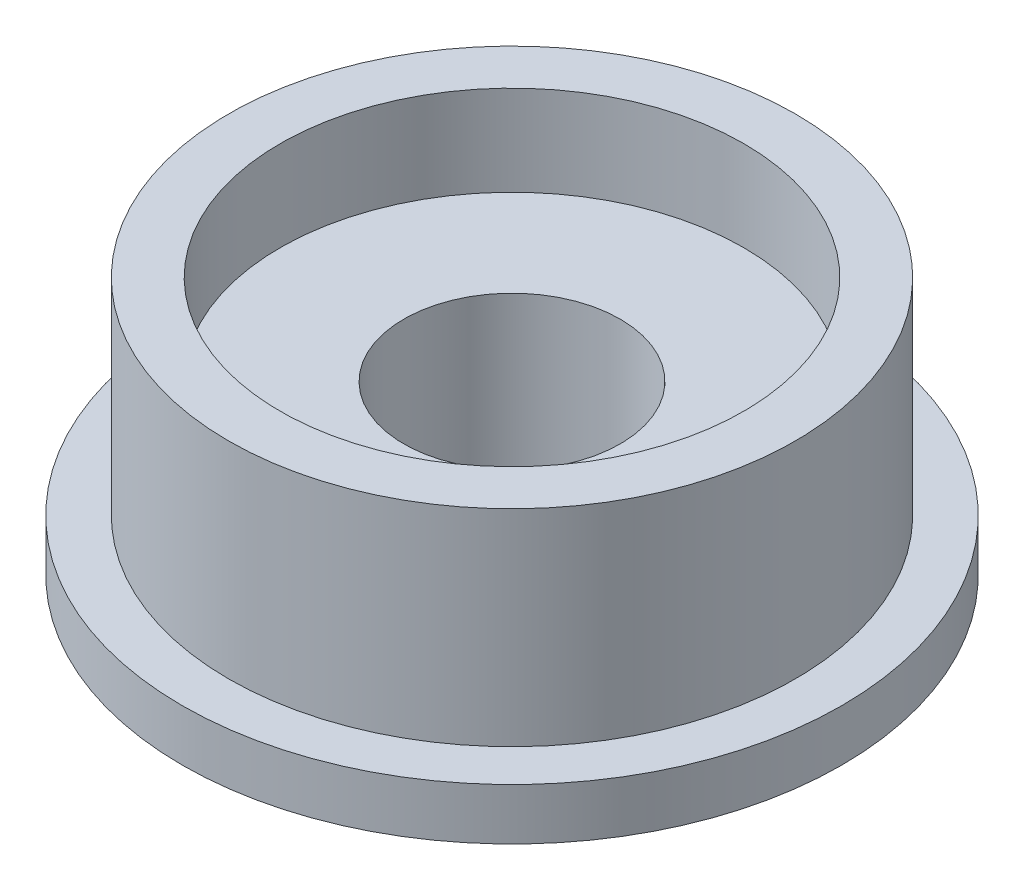
ISO-10303-21;
HEADER;
FILE_DESCRIPTION(('STEP AP214'),'2;1');
FILE_NAME('part.step','',(''),(''),'','','');
FILE_SCHEMA(('AUTOMOTIVE_DESIGN { 1 0 10303 214 1 1 1 1 }'));
ENDSEC;
DATA;
#1=APPLICATION_CONTEXT('core data for automotive mechanical design processes');
#2=APPLICATION_PROTOCOL_DEFINITION('international standard','automotive_design',2000,#1);
#3=PRODUCT_CONTEXT('',#1,'mechanical');
#4=PRODUCT('Part','Part','',(#3));
#5=PRODUCT_RELATED_PRODUCT_CATEGORY('part','',(#4));
#6=PRODUCT_DEFINITION_FORMATION('','',#4);
#7=PRODUCT_DEFINITION_CONTEXT('part definition',#1,'design');
#8=PRODUCT_DEFINITION('design','',#6,#7);
#9=PRODUCT_DEFINITION_SHAPE('','',#8);
#10=(LENGTH_UNIT() NAMED_UNIT(*) SI_UNIT(.MILLI.,.METRE.));
#11=(NAMED_UNIT(*) PLANE_ANGLE_UNIT() SI_UNIT($,.RADIAN.));
#12=(NAMED_UNIT(*) SI_UNIT($,.STERADIAN.) SOLID_ANGLE_UNIT());
#13=UNCERTAINTY_MEASURE_WITH_UNIT(LENGTH_MEASURE(1.E-05),#10,'distance_accuracy_value','');
#14=(GEOMETRIC_REPRESENTATION_CONTEXT(3) GLOBAL_UNCERTAINTY_ASSIGNED_CONTEXT((#13)) GLOBAL_UNIT_ASSIGNED_CONTEXT((#10,
#11,#12)) REPRESENTATION_CONTEXT('',''));
#15=CARTESIAN_POINT('',(0.,0.,0.));
#16=DIRECTION('',(0.,0.,1.));
#17=DIRECTION('',(1.,0.,0.));
#18=AXIS2_PLACEMENT_3D('',#15,#16,#17);
#19=CARTESIAN_POINT('',(4.2,0.,0.));
#20=DIRECTION('',(0.,-1.,0.));
#21=DIRECTION('',(0.,0.,-1.));
#22=AXIS2_PLACEMENT_3D('',#19,#20,#21);
#23=PLANE('',#22);
#24=CARTESIAN_POINT('',(0.,0.,0.));
#25=DIRECTION('',(0.,-1.,0.));
#26=DIRECTION('',(0.,0.,-1.));
#27=AXIS2_PLACEMENT_3D('',#24,#25,#26);
#28=CIRCLE('',#27,12.8);
#29=CARTESIAN_POINT('',(0.,0.,-12.8));
#30=VERTEX_POINT('',#29);
#31=EDGE_CURVE('E63',#30,#30,#28,.T.);
#32=ORIENTED_EDGE('',*,*,#31,.T.);
#33=EDGE_LOOP('',(#32));
#34=FACE_BOUND('',#33,.T.);
#35=CARTESIAN_POINT('',(0.,0.,0.));
#36=DIRECTION('',(0.,-1.,0.));
#37=DIRECTION('',(0.,0.,-1.));
#38=AXIS2_PLACEMENT_3D('',#35,#36,#37);
#39=CIRCLE('',#38,4.2);
#40=CARTESIAN_POINT('',(0.,0.,-4.2));
#41=VERTEX_POINT('',#40);
#42=EDGE_CURVE('E10',#41,#41,#39,.T.);
#43=ORIENTED_EDGE('',*,*,#42,.F.);
#44=EDGE_LOOP('',(#43));
#45=FACE_BOUND('',#44,.T.);
#46=ADVANCED_FACE('F35',(#34,#45),#23,.T.);
#47=CARTESIAN_POINT('',(0.,0.,0.));
#48=DIRECTION('',(0.,-1.,0.));
#49=DIRECTION('',(0.,0.,-1.));
#50=AXIS2_PLACEMENT_3D('',#47,#48,#49);
#51=CYLINDRICAL_SURFACE('',#50,4.2);
#52=ORIENTED_EDGE('',*,*,#42,.T.);
#53=EDGE_LOOP('',(#52));
#54=FACE_BOUND('',#53,.T.);
#55=CARTESIAN_POINT('',(0.,6.5,0.));
#56=DIRECTION('',(0.,-1.,0.));
#57=DIRECTION('',(0.,0.,-1.));
#58=AXIS2_PLACEMENT_3D('',#55,#56,#57);
#59=CIRCLE('',#58,4.2);
#60=CARTESIAN_POINT('',(0.,6.5,-4.2));
#61=VERTEX_POINT('',#60);
#62=EDGE_CURVE('E41',#61,#61,#59,.T.);
#63=ORIENTED_EDGE('',*,*,#62,.F.);
#64=EDGE_LOOP('',(#63));
#65=FACE_BOUND('',#64,.T.);
#66=ADVANCED_FACE('F81',(#54,#65),#51,.F.);
#67=CARTESIAN_POINT('',(4.2,6.5,0.));
#68=DIRECTION('',(0.,1.,0.));
#69=DIRECTION('',(0.,0.,1.));
#70=AXIS2_PLACEMENT_3D('',#67,#68,#69);
#71=PLANE('',#70);
#72=ORIENTED_EDGE('',*,*,#62,.T.);
#73=EDGE_LOOP('',(#72));
#74=FACE_BOUND('',#73,.T.);
#75=CARTESIAN_POINT('',(0.,6.5,0.));
#76=DIRECTION('',(0.,-1.,0.));
#77=DIRECTION('',(0.,0.,-1.));
#78=AXIS2_PLACEMENT_3D('',#75,#76,#77);
#79=CIRCLE('',#78,9.);
#80=CARTESIAN_POINT('',(0.,6.5,-9.));
#81=VERTEX_POINT('',#80);
#82=EDGE_CURVE('E45',#81,#81,#79,.T.);
#83=ORIENTED_EDGE('',*,*,#82,.F.);
#84=EDGE_LOOP('',(#83));
#85=FACE_BOUND('',#84,.T.);
#86=ADVANCED_FACE('F85',(#74,#85),#71,.T.);
#87=CARTESIAN_POINT('',(0.,0.,0.));
#88=DIRECTION('',(0.,-1.,0.));
#89=DIRECTION('',(0.,0.,-1.));
#90=AXIS2_PLACEMENT_3D('',#87,#88,#89);
#91=CYLINDRICAL_SURFACE('',#90,9.);
#92=ORIENTED_EDGE('',*,*,#82,.T.);
#93=EDGE_LOOP('',(#92));
#94=FACE_BOUND('',#93,.T.);
#95=CARTESIAN_POINT('',(0.,10.,0.));
#96=DIRECTION('',(0.,-1.,0.));
#97=DIRECTION('',(0.,0.,-1.));
#98=AXIS2_PLACEMENT_3D('',#95,#96,#97);
#99=CIRCLE('',#98,9.);
#100=CARTESIAN_POINT('',(0.,10.,-9.));
#101=VERTEX_POINT('',#100);
#102=EDGE_CURVE('E49',#101,#101,#99,.T.);
#103=ORIENTED_EDGE('',*,*,#102,.F.);
#104=EDGE_LOOP('',(#103));
#105=FACE_BOUND('',#104,.T.);
#106=ADVANCED_FACE('F89',(#94,#105),#91,.F.);
#107=CARTESIAN_POINT('',(9.,10.,0.));
#108=DIRECTION('',(0.,1.,0.));
#109=DIRECTION('',(0.,0.,1.));
#110=AXIS2_PLACEMENT_3D('',#107,#108,#109);
#111=PLANE('',#110);
#112=ORIENTED_EDGE('',*,*,#102,.T.);
#113=EDGE_LOOP('',(#112));
#114=FACE_BOUND('',#113,.T.);
#115=CARTESIAN_POINT('',(0.,10.,0.));
#116=DIRECTION('',(0.,-1.,0.));
#117=DIRECTION('',(0.,0.,-1.));
#118=AXIS2_PLACEMENT_3D('',#115,#116,#117);
#119=CIRCLE('',#118,11.);
#120=CARTESIAN_POINT('',(0.,10.,-11.));
#121=VERTEX_POINT('',#120);
#122=EDGE_CURVE('E54',#121,#121,#119,.T.);
#123=ORIENTED_EDGE('',*,*,#122,.F.);
#124=EDGE_LOOP('',(#123));
#125=FACE_BOUND('',#124,.T.);
#126=ADVANCED_FACE('F95',(#114,#125),#111,.T.);
#127=CARTESIAN_POINT('',(0.,0.,0.));
#128=DIRECTION('',(0.,-1.,0.));
#129=DIRECTION('',(0.,0.,-1.));
#130=AXIS2_PLACEMENT_3D('',#127,#128,#129);
#131=CYLINDRICAL_SURFACE('',#130,11.);
#132=ORIENTED_EDGE('',*,*,#122,.T.);
#133=EDGE_LOOP('',(#132));
#134=FACE_BOUND('',#133,.T.);
#135=CARTESIAN_POINT('',(0.,2.,0.));
#136=DIRECTION('',(0.,-1.,0.));
#137=DIRECTION('',(0.,0.,-1.));
#138=AXIS2_PLACEMENT_3D('',#135,#136,#137);
#139=CIRCLE('',#138,11.);
#140=CARTESIAN_POINT('',(0.,2.,-11.));
#141=VERTEX_POINT('',#140);
#142=EDGE_CURVE('E57',#141,#141,#139,.T.);
#143=ORIENTED_EDGE('',*,*,#142,.F.);
#144=EDGE_LOOP('',(#143));
#145=FACE_BOUND('',#144,.T.);
#146=ADVANCED_FACE('F77',(#134,#145),#131,.T.);
#147=CARTESIAN_POINT('',(11.,2.,0.));
#148=DIRECTION('',(0.,1.,0.));
#149=DIRECTION('',(0.,0.,1.));
#150=AXIS2_PLACEMENT_3D('',#147,#148,#149);
#151=PLANE('',#150);
#152=ORIENTED_EDGE('',*,*,#142,.T.);
#153=EDGE_LOOP('',(#152));
#154=FACE_BOUND('',#153,.T.);
#155=CARTESIAN_POINT('',(0.,2.,0.));
#156=DIRECTION('',(0.,-1.,0.));
#157=DIRECTION('',(0.,0.,-1.));
#158=AXIS2_PLACEMENT_3D('',#155,#156,#157);
#159=CIRCLE('',#158,12.8);
#160=CARTESIAN_POINT('',(0.,2.,-12.8));
#161=VERTEX_POINT('',#160);
#162=EDGE_CURVE('E60',#161,#161,#159,.T.);
#163=ORIENTED_EDGE('',*,*,#162,.F.);
#164=EDGE_LOOP('',(#163));
#165=FACE_BOUND('',#164,.T.);
#166=ADVANCED_FACE('F71',(#154,#165),#151,.T.);
#167=CARTESIAN_POINT('',(0.,0.,0.));
#168=DIRECTION('',(0.,-1.,0.));
#169=DIRECTION('',(0.,0.,-1.));
#170=AXIS2_PLACEMENT_3D('',#167,#168,#169);
#171=CYLINDRICAL_SURFACE('',#170,12.8);
#172=ORIENTED_EDGE('',*,*,#162,.T.);
#173=EDGE_LOOP('',(#172));
#174=FACE_BOUND('',#173,.T.);
#175=ORIENTED_EDGE('',*,*,#31,.F.);
#176=EDGE_LOOP('',(#175));
#177=FACE_BOUND('',#176,.T.);
#178=ADVANCED_FACE('F69',(#174,#177),#171,.T.);
#179=CLOSED_SHELL('',(#46,#66,#86,#106,#126,#146,#166,#178));
#180=MANIFOLD_SOLID_BREP('B2',#179);
#181=ADVANCED_BREP_SHAPE_REPRESENTATION('',(#18,#180),#14);
#182=SHAPE_DEFINITION_REPRESENTATION(#9,#181);
ENDSEC;
END-ISO-10303-21;
